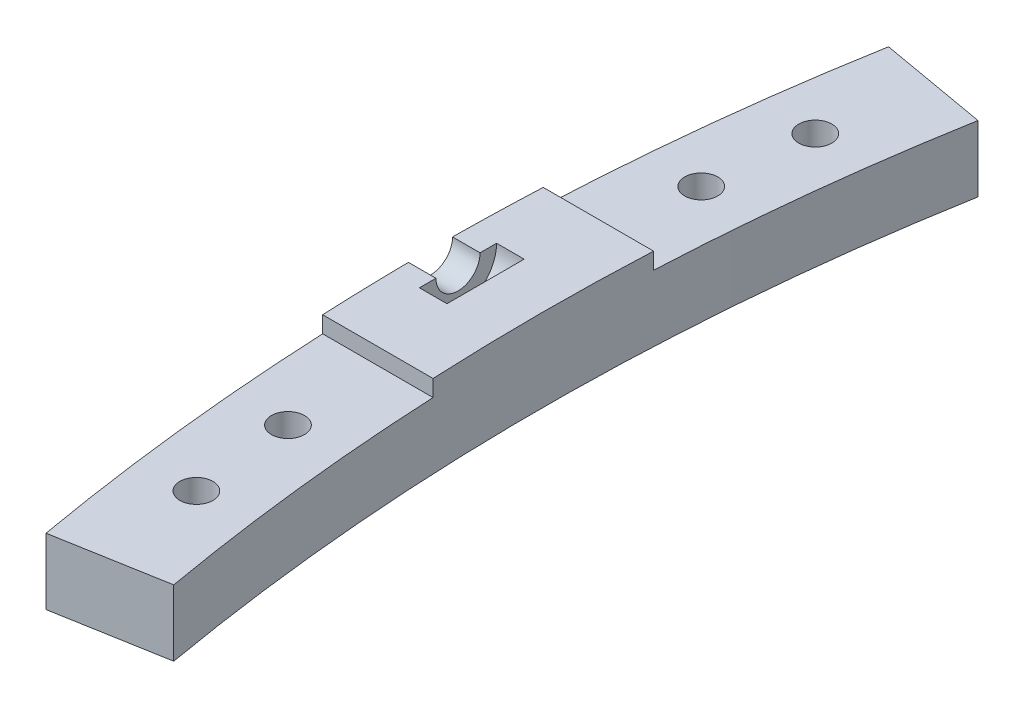
ISO-10303-21;
HEADER;
FILE_DESCRIPTION(('STEP AP214'),'2;1');
FILE_NAME('part.step','',(''),(''),'','','');
FILE_SCHEMA(('AUTOMOTIVE_DESIGN { 1 0 10303 214 1 1 1 1 }'));
ENDSEC;
DATA;
#1=APPLICATION_CONTEXT('core data for automotive mechanical design processes');
#2=APPLICATION_PROTOCOL_DEFINITION('international standard','automotive_design',2000,#1);
#3=PRODUCT_CONTEXT('',#1,'mechanical');
#4=PRODUCT('Part','Part','',(#3));
#5=PRODUCT_RELATED_PRODUCT_CATEGORY('part','',(#4));
#6=PRODUCT_DEFINITION_FORMATION('','',#4);
#7=PRODUCT_DEFINITION_CONTEXT('part definition',#1,'design');
#8=PRODUCT_DEFINITION('design','',#6,#7);
#9=PRODUCT_DEFINITION_SHAPE('','',#8);
#10=(LENGTH_UNIT() NAMED_UNIT(*) SI_UNIT(.MILLI.,.METRE.));
#11=(NAMED_UNIT(*) PLANE_ANGLE_UNIT() SI_UNIT($,.RADIAN.));
#12=(NAMED_UNIT(*) SI_UNIT($,.STERADIAN.) SOLID_ANGLE_UNIT());
#13=UNCERTAINTY_MEASURE_WITH_UNIT(LENGTH_MEASURE(1.E-05),#10,'distance_accuracy_value','');
#14=(GEOMETRIC_REPRESENTATION_CONTEXT(3) GLOBAL_UNCERTAINTY_ASSIGNED_CONTEXT((#13)) GLOBAL_UNIT_ASSIGNED_CONTEXT((#10,
#11,#12)) REPRESENTATION_CONTEXT('',''));
#15=CARTESIAN_POINT('',(0.,0.,0.));
#16=DIRECTION('',(0.,0.,1.));
#17=DIRECTION('',(1.,0.,0.));
#18=AXIS2_PLACEMENT_3D('',#15,#16,#17);
#19=CARTESIAN_POINT('',(0.,7.5,0.));
#20=DIRECTION('',(-0.173648177666931,0.,0.984807753012208));
#21=DIRECTION('',(0.984807753012208,0.,0.173648177666931));
#22=AXIS2_PLACEMENT_3D('',#19,#20,#21);
#23=PLANE('',#22);
#24=DIRECTION('',(0.984807753012208,0.,0.17364817766693));
#25=VECTOR('',#24,1.);
#26=CARTESIAN_POINT('',(-206.809628132564,-1.5,-36.4661173100554));
#27=LINE('',#26,#25);
#28=CARTESIAN_POINT('',(-216.657705662686,-1.5,-38.2025990867248));
#29=VERTEX_POINT('',#28);
#30=CARTESIAN_POINT('',(-206.809628132564,-1.5,-36.4661173100554));
#31=VERTEX_POINT('',#30);
#32=EDGE_CURVE('E177',#29,#31,#27,.T.);
#33=ORIENTED_EDGE('',*,*,#32,.T.);
#34=DIRECTION('',(0.,-1.,0.));
#35=VECTOR('',#34,1.);
#36=CARTESIAN_POINT('',(-206.809628132564,7.5,-36.4661173100555));
#37=LINE('',#36,#35);
#38=CARTESIAN_POINT('',(-206.809628132564,-7.5,-36.4661173100555));
#39=VERTEX_POINT('',#38);
#40=EDGE_CURVE('E180',#31,#39,#37,.T.);
#41=ORIENTED_EDGE('',*,*,#40,.T.);
#42=DIRECTION('',(-0.984807753012208,0.,-0.173648177666931));
#43=VECTOR('',#42,1.);
#44=CARTESIAN_POINT('',(0.,-7.5,0.));
#45=LINE('',#44,#43);
#46=CARTESIAN_POINT('',(-216.657705662686,-7.5,-38.2025990867248));
#47=VERTEX_POINT('',#46);
#48=EDGE_CURVE('E291',#39,#47,#45,.T.);
#49=ORIENTED_EDGE('',*,*,#48,.T.);
#50=DIRECTION('',(0.,-1.,0.));
#51=VECTOR('',#50,1.);
#52=CARTESIAN_POINT('',(-216.657705662686,7.5,-38.2025990867248));
#53=LINE('',#52,#51);
#54=EDGE_CURVE('E182',#29,#47,#53,.T.);
#55=ORIENTED_EDGE('',*,*,#54,.F.);
#56=EDGE_LOOP('',(#33,#41,#49,#55));
#57=FACE_BOUND('',#56,.T.);
#58=ADVANCED_FACE('F35',(#57),#23,.F.);
#59=CARTESIAN_POINT('',(0.,7.5,0.));
#60=DIRECTION('',(0.173648177666931,0.,0.984807753012208));
#61=DIRECTION('',(0.984807753012208,0.,-0.173648177666931));
#62=AXIS2_PLACEMENT_3D('',#59,#60,#61);
#63=PLANE('',#62);
#64=DIRECTION('',(0.,-1.,0.));
#65=VECTOR('',#64,1.);
#66=CARTESIAN_POINT('',(-206.809628132564,7.5,36.4661173100555));
#67=LINE('',#66,#65);
#68=CARTESIAN_POINT('',(-206.809628132564,-1.5,36.4661173100554));
#69=VERTEX_POINT('',#68);
#70=CARTESIAN_POINT('',(-206.809628132564,-7.5,36.4661173100555));
#71=VERTEX_POINT('',#70);
#72=EDGE_CURVE('E299',#69,#71,#67,.T.);
#73=ORIENTED_EDGE('',*,*,#72,.F.);
#74=DIRECTION('',(-0.984807753012208,0.,0.17364817766693));
#75=VECTOR('',#74,1.);
#76=CARTESIAN_POINT('',(-206.809628132564,-1.5,36.4661173100554));
#77=LINE('',#76,#75);
#78=CARTESIAN_POINT('',(-216.657705662686,-1.5,38.2025990867248));
#79=VERTEX_POINT('',#78);
#80=EDGE_CURVE('E274',#69,#79,#77,.T.);
#81=ORIENTED_EDGE('',*,*,#80,.T.);
#82=DIRECTION('',(0.,-1.,0.));
#83=VECTOR('',#82,1.);
#84=CARTESIAN_POINT('',(-216.657705662686,7.5,38.2025990867248));
#85=LINE('',#84,#83);
#86=CARTESIAN_POINT('',(-216.657705662686,-7.5,38.2025990867248));
#87=VERTEX_POINT('',#86);
#88=EDGE_CURVE('E197',#79,#87,#85,.T.);
#89=ORIENTED_EDGE('',*,*,#88,.T.);
#90=DIRECTION('',(-0.984807753012208,0.,0.173648177666931));
#91=VECTOR('',#90,1.);
#92=CARTESIAN_POINT('',(0.,-7.5,0.));
#93=LINE('',#92,#91);
#94=EDGE_CURVE('E296',#71,#87,#93,.T.);
#95=ORIENTED_EDGE('',*,*,#94,.F.);
#96=EDGE_LOOP('',(#73,#81,#89,#95));
#97=FACE_BOUND('',#96,.T.);
#98=ADVANCED_FACE('F166',(#97),#63,.T.);
#99=CARTESIAN_POINT('',(0.,7.5,0.));
#100=DIRECTION('',(0.,-1.,0.));
#101=DIRECTION('',(0.,0.,-1.));
#102=AXIS2_PLACEMENT_3D('',#99,#100,#101);
#103=CYLINDRICAL_SURFACE('',#102,210.);
#104=CARTESIAN_POINT('',(0.,0.,0.));
#105=DIRECTION('',(0.,-1.,0.));
#106=DIRECTION('',(0.,0.,-1.));
#107=AXIS2_PLACEMENT_3D('',#104,#105,#106);
#108=CIRCLE('',#107,210.);
#109=CARTESIAN_POINT('',(-209.76176963403,0.,10.));
#110=VERTEX_POINT('',#109);
#111=CARTESIAN_POINT('',(-209.76176963403,0.,-10.));
#112=VERTEX_POINT('',#111);
#113=EDGE_CURVE('E230',#110,#112,#108,.T.);
#114=ORIENTED_EDGE('',*,*,#113,.F.);
#115=DIRECTION('',(0.,-1.,0.));
#116=VECTOR('',#115,1.);
#117=CARTESIAN_POINT('',(-209.76176963403,32.5390961188828,10.));
#118=LINE('',#117,#116);
#119=CARTESIAN_POINT('',(-209.76176963403,-1.5,10.));
#120=VERTEX_POINT('',#119);
#121=EDGE_CURVE('E279',#110,#120,#118,.T.);
#122=ORIENTED_EDGE('',*,*,#121,.T.);
#123=CARTESIAN_POINT('',(0.,-1.5,0.));
#124=DIRECTION('',(0.,1.,0.));
#125=DIRECTION('',(0.,0.,1.));
#126=AXIS2_PLACEMENT_3D('',#123,#124,#125);
#127=CIRCLE('',#126,210.);
#128=EDGE_CURVE('E271',#120,#69,#127,.T.);
#129=ORIENTED_EDGE('',*,*,#128,.T.);
#130=ORIENTED_EDGE('',*,*,#72,.T.);
#131=CARTESIAN_POINT('',(0.,-7.5,0.));
#132=DIRECTION('',(0.,1.,0.));
#133=DIRECTION('',(0.,0.,1.));
#134=AXIS2_PLACEMENT_3D('',#131,#132,#133);
#135=CIRCLE('',#134,210.);
#136=EDGE_CURVE('E195',#39,#71,#135,.T.);
#137=ORIENTED_EDGE('',*,*,#136,.F.);
#138=ORIENTED_EDGE('',*,*,#40,.F.);
#139=CARTESIAN_POINT('',(0.,-1.5,0.));
#140=DIRECTION('',(0.,1.,0.));
#141=DIRECTION('',(0.,0.,1.));
#142=AXIS2_PLACEMENT_3D('',#139,#140,#141);
#143=CIRCLE('',#142,210.);
#144=CARTESIAN_POINT('',(-209.76176963403,-1.5,-10.));
#145=VERTEX_POINT('',#144);
#146=EDGE_CURVE('E187',#31,#145,#143,.T.);
#147=ORIENTED_EDGE('',*,*,#146,.T.);
#148=DIRECTION('',(0.,-1.,0.));
#149=VECTOR('',#148,1.);
#150=CARTESIAN_POINT('',(-209.76176963403,32.5390961188828,-10.));
#151=LINE('',#150,#149);
#152=EDGE_CURVE('E186',#112,#145,#151,.T.);
#153=ORIENTED_EDGE('',*,*,#152,.F.);
#154=EDGE_LOOP('',(#114,#122,#129,#130,#137,#138,#147,#153));
#155=FACE_BOUND('',#154,.T.);
#156=ADVANCED_FACE('F37',(#155),#103,.F.);
#157=CARTESIAN_POINT('',(0.,7.5,0.));
#158=DIRECTION('',(0.,-1.,0.));
#159=DIRECTION('',(0.,0.,-1.));
#160=AXIS2_PLACEMENT_3D('',#157,#158,#159);
#161=CYLINDRICAL_SURFACE('',#160,220.);
#162=DIRECTION('',(0.,-1.,0.));
#163=VECTOR('',#162,1.);
#164=CARTESIAN_POINT('',(-219.772609758359,32.5390961188828,10.));
#165=LINE('',#164,#163);
#166=CARTESIAN_POINT('',(-219.772609758359,0.,10.));
#167=VERTEX_POINT('',#166);
#168=CARTESIAN_POINT('',(-219.772609758359,-1.5,10.));
#169=VERTEX_POINT('',#168);
#170=EDGE_CURVE('E281',#167,#169,#165,.T.);
#171=ORIENTED_EDGE('',*,*,#170,.F.);
#172=CARTESIAN_POINT('',(0.,0.,0.));
#173=DIRECTION('',(0.,-1.,0.));
#174=DIRECTION('',(0.,0.,-1.));
#175=AXIS2_PLACEMENT_3D('',#172,#173,#174);
#176=CIRCLE('',#175,220.);
#177=CARTESIAN_POINT('',(-219.995436945303,1.28032221009402E-05,2.00000001985987));
#178=VERTEX_POINT('',#177);
#179=EDGE_CURVE('E214',#167,#178,#176,.T.);
#180=ORIENTED_EDGE('',*,*,#179,.T.);
#181=CARTESIAN_POINT('',(-219.990908902837,2.54949305564592E-05,2.00000002591936));
#182=CARTESIAN_POINT('',(-219.9909088471,-0.0329801205389384,2.00000403034315));
#183=CARTESIAN_POINT('',(-219.990916022715,-0.0659874772265435,1.99921678022259));
#184=CARTESIAN_POINT('',(-219.990944841505,-0.131686984836702,1.99604421576729));
#185=CARTESIAN_POINT('',(-219.990966380228,-0.164379695087106,1.99367043876746));
#186=CARTESIAN_POINT('',(-219.991023787441,-0.229450334038055,1.98732542961615));
#187=CARTESIAN_POINT('',(-219.991059585957,-0.261829020419946,1.98336199730463));
#188=CARTESIAN_POINT('',(-219.991145206338,-0.326271218955907,1.97384233279031));
#189=CARTESIAN_POINT('',(-219.991194993972,-0.358335305144357,1.96828998790077));
#190=CARTESIAN_POINT('',(-219.991308199897,-0.422148622653585,1.95559625627867));
#191=CARTESIAN_POINT('',(-219.991371618698,-0.453897842131137,1.94845481000952));
#192=CARTESIAN_POINT('',(-219.991511588414,-0.517082073280422,1.9325869002976));
#193=CARTESIAN_POINT('',(-219.991588171844,-0.548516097980451,1.92385650905892));
#194=CARTESIAN_POINT('',(-219.991753353404,-0.610874375613472,1.90487438730628));
#195=CARTESIAN_POINT('',(-219.991841935093,-0.641799262266957,1.89462473675976));
#196=CARTESIAN_POINT('',(-219.992030794494,-0.70334097560408,1.87256757035672));
#197=CARTESIAN_POINT('',(-219.992131152415,-0.733953938429955,1.86074928953589));
#198=CARTESIAN_POINT('',(-219.992343013102,-0.794936777451035,1.8355317226526));
#199=CARTESIAN_POINT('',(-219.992454631342,-0.825299747117946,1.82211573189001));
#200=CARTESIAN_POINT('',(-219.992686426338,-0.885113104167555,1.79391088113034));
#201=CARTESIAN_POINT('',(-219.992806535192,-0.914568511126935,1.77913267731943));
#202=CARTESIAN_POINT('',(-219.993053690953,-0.972388046336483,1.74830280597472));
#203=CARTESIAN_POINT('',(-219.993180646541,-1.00076063606044,1.73226701257369));
#204=CARTESIAN_POINT('',(-219.99344126088,-1.05660670666691,1.69884687333441));
#205=CARTESIAN_POINT('',(-219.993574902586,-1.08408220555508,1.68146590049603));
#206=CARTESIAN_POINT('',(-219.993847913439,-1.13813580936392,1.64535896901692));
#207=CARTESIAN_POINT('',(-219.993987282743,-1.16471388959116,1.62663297341072));
#208=CARTESIAN_POINT('',(-219.994270705356,-1.21697478482335,1.58783939375478));
#209=CARTESIAN_POINT('',(-219.99441476947,-1.24265520421705,1.56776858329221));
#210=CARTESIAN_POINT('',(-219.994705860713,-1.29301746913009,1.52637541433165));
#211=CARTESIAN_POINT('',(-219.994852889913,-1.31769857775162,1.50505215967964));
#212=CARTESIAN_POINT('',(-219.995149329224,-1.36617788630476,1.46108122017411));
#213=CARTESIAN_POINT('',(-219.995298748868,-1.38996838392072,1.43842505079253));
#214=CARTESIAN_POINT('',(-219.995598493492,-1.43662960021816,1.39183004381227));
#215=CARTESIAN_POINT('',(-219.995748816476,-1.45949172740487,1.36788260155963));
#216=CARTESIAN_POINT('',(-219.996046867252,-1.50385484890476,1.3190731186851));
#217=CARTESIAN_POINT('',(-219.996194605952,-1.52536449173443,1.2942189455876));
#218=CARTESIAN_POINT('',(-219.996485956422,-1.56693861893175,1.24370374618333));
#219=CARTESIAN_POINT('',(-219.996629593364,-1.58701436426977,1.21805199098032));
#220=CARTESIAN_POINT('',(-219.996912431906,-1.62582074894098,1.16584734880919));
#221=CARTESIAN_POINT('',(-219.997051643476,-1.64455455159365,1.13929681396787));
#222=CARTESIAN_POINT('',(-219.997324662941,-1.68068000084828,1.0852972450644));
#223=CARTESIAN_POINT('',(-219.997458470756,-1.69807162746446,1.05784819763153));
#224=CARTESIAN_POINT('',(-219.997719688283,-1.731515975671,1.00205393602615));
#225=CARTESIAN_POINT('',(-219.997847081331,-1.74756527518609,0.973706671049482));
#226=CARTESIAN_POINT('',(-219.998094189706,-1.77829621077494,0.916178251572959));
#227=CARTESIAN_POINT('',(-219.998213882477,-1.79297388137631,0.886994979707456));
#228=CARTESIAN_POINT('',(-219.99844483791,-1.82100270222331,0.827739676021173));
#229=CARTESIAN_POINT('',(-219.998556033128,-1.83434345867634,0.797662733116911));
#230=CARTESIAN_POINT('',(-219.998768740288,-1.8596797914863,0.736675005217262));
#231=CARTESIAN_POINT('',(-219.998870170879,-1.87166419218445,0.705759576503797));
#232=CARTESIAN_POINT('',(-219.999060753003,-1.89402076299834,0.643604257289761));
#233=CARTESIAN_POINT('',(-219.999149988481,-1.90440402543416,0.612368362187968));
#234=CARTESIAN_POINT('',(-219.999315620733,-1.92354152903219,0.549639204908718));
#235=CARTESIAN_POINT('',(-219.999392102714,-1.93230662729597,0.518149257433229));
#236=CARTESIAN_POINT('',(-219.999532069439,-1.94823793954838,0.454849896674932));
#237=CARTESIAN_POINT('',(-219.999595585804,-1.955408047338,0.423041463988725));
#238=CARTESIAN_POINT('',(-219.999709237058,-1.96815310390177,0.359106474455244));
#239=CARTESIAN_POINT('',(-219.99975937189,-1.97372804585566,0.326979916248406));
#240=CARTESIAN_POINT('',(-219.999845878029,-1.98328694072775,0.262409532453783));
#241=CARTESIAN_POINT('',(-219.999882214848,-1.98726690827734,0.229965117104903));
#242=CARTESIAN_POINT('',(-219.999940730871,-1.99363904728712,0.164759791953047));
#243=CARTESIAN_POINT('',(-219.999962839369,-1.99602329116913,0.131998110397101));
#244=CARTESIAN_POINT('',(-219.999992540729,-1.99921089453943,0.066157420490343));
#245=CARTESIAN_POINT('',(-220.000000026233,-2.00000256300872,0.0330778438731048));
#246=CARTESIAN_POINT('',(-220.,-2.,0.));
#247=B_SPLINE_CURVE_WITH_KNOTS('',3,(#181,#182,#183,#184,#185,#186,#187,#188,#189,#190,#191,
#192,#193,#194,#195,#196,#197,#198,#199,#200,#201,#202,#203,#204,#205,#206,#207,#208,#209,#210,
#211,#212,#213,#214,#215,#216,#217,#218,#219,#220,#221,#222,#223,#224,#225,#226,#227,#228,#229,
#230,#231,#232,#233,#234,#235,#236,#237,#238,#239,#240,#241,#242,#243,#244,#245,#246),
.UNSPECIFIED.,.F.,.F.,(4,2,2,2,2,2,2,2,2,2,2,2,2,2,2,2,2,2,2,2,2,2,2,2,2,2,2,2,2,2,2,2,4),(0.,
0.0990098120352928,0.197307340229156,0.295128347103944,0.39271204907366,0.490299407688165,
0.588131357477474,0.685830585183113,0.784238769304348,0.883785123878142,0.982609913063426,
1.08034281784735,1.17783814070924,1.27533614407649,1.37307707060712,1.47088880585223,
1.5694099857165,1.66869732534898,1.76726656744023,1.8649489821143,1.96239299030713,
2.05983844921885,2.15752520536166,2.25548616720321,2.35415766578728,2.45359063993971,
2.55230040347897,2.65032167769756,2.74810096338728,2.84588066713364,2.94390319241927,
3.04240915013852,3.1416356344712),.UNSPECIFIED.);
#248=CARTESIAN_POINT('',(-220.,-2.,0.));
#249=VERTEX_POINT('',#248);
#250=EDGE_CURVE('E60',#178,#249,#247,.T.);
#251=ORIENTED_EDGE('',*,*,#250,.T.);
#252=CARTESIAN_POINT('',(-220.,-2.,0.));
#253=CARTESIAN_POINT('',(-220.000000010613,-2.00000102153851,-0.0264510910848524));
#254=CARTESIAN_POINT('',(-219.999995229921,-1.99949529344123,-0.0529029432307503));
#255=CARTESIAN_POINT('',(-219.999976219647,-1.99746070070361,-0.105603904716159));
#256=CARTESIAN_POINT('',(-219.999962048466,-1.99593815939092,-0.131853259026521));
#257=CARTESIAN_POINT('',(-219.999924476883,-1.99187019733549,-0.184149418022017));
#258=CARTESIAN_POINT('',(-219.999901119933,-1.98932959135356,-0.210196595950305));
#259=CARTESIAN_POINT('',(-219.999845410793,-1.983227371353,-0.262088174027472));
#260=CARTESIAN_POINT('',(-219.9998130871,-1.97966899088132,-0.287932954179401));
#261=CARTESIAN_POINT('',(-219.999739672388,-1.97153274235715,-0.339419779170902));
#262=CARTESIAN_POINT('',(-219.99969859529,-1.96695649256651,-0.365062079647499));
#263=CARTESIAN_POINT('',(-219.999607900678,-1.95678616021779,-0.416144081738603));
#264=CARTESIAN_POINT('',(-219.999558283142,-1.95119207505807,-0.441583782835083));
#265=CARTESIAN_POINT('',(-219.999450731847,-1.9389876919062,-0.49226086648363));
#266=CARTESIAN_POINT('',(-219.999392785021,-1.93237579604974,-0.51749786410461));
#267=CARTESIAN_POINT('',(-219.999268796804,-1.91813738627874,-0.567769941237892));
#268=CARTESIAN_POINT('',(-219.999202730434,-1.91050773474378,-0.592804131629155));
#269=CARTESIAN_POINT('',(-219.99906280341,-1.89424482382492,-0.642642029652548));
#270=CARTESIAN_POINT('',(-219.998988916054,-1.88560811532778,-0.667444611110266));
#271=CARTESIAN_POINT('',(-219.998833499111,-1.86732541555779,-0.716849409851232));
#272=CARTESIAN_POINT('',(-219.998751925012,-1.8576735026943,-0.74144943369842));
#273=CARTESIAN_POINT('',(-219.998581873924,-1.83742462494737,-0.790297878479858));
#274=CARTESIAN_POINT('',(-219.998493387404,-1.82682635212366,-0.814545757219763));
#275=CARTESIAN_POINT('',(-219.998310741967,-1.80476070606011,-0.862462281405873));
#276=CARTESIAN_POINT('',(-219.998216621323,-1.79329908471358,-0.886133573727658));
#277=CARTESIAN_POINT('',(-219.998023391418,-1.76952197102024,-0.932870183444575));
#278=CARTESIAN_POINT('',(-219.997924314382,-1.75721183679726,-0.955938225931451));
#279=CARTESIAN_POINT('',(-219.997721626057,-1.73172743227803,-1.00149720358726));
#280=CARTESIAN_POINT('',(-219.99761802995,-1.71855599044985,-1.02398972054132));
#281=CARTESIAN_POINT('',(-219.997406842504,-1.69135044656174,-1.06839826686543));
#282=CARTESIAN_POINT('',(-219.997299257703,-1.67731773345395,-1.09031514705931));
#283=CARTESIAN_POINT('',(-219.997080616295,-1.64839109184519,-1.13357318095671));
#284=CARTESIAN_POINT('',(-219.996969559667,-1.63349715823886,-1.15491433124615));
#285=CARTESIAN_POINT('',(-219.996744482375,-1.60284946571431,-1.19702178418617));
#286=CARTESIAN_POINT('',(-219.996630457289,-1.58709438006606,-1.21778712104268));
#287=CARTESIAN_POINT('',(-219.9963999352,-1.55472569418271,-1.25874392842057));
#288=CARTESIAN_POINT('',(-219.996283431534,-1.53810954228534,-1.27893338181079));
#289=CARTESIAN_POINT('',(-219.996048702796,-1.50405970567614,-1.31869303386023));
#290=CARTESIAN_POINT('',(-219.995930474314,-1.48662418691128,-1.33826166131736));
#291=CARTESIAN_POINT('',(-219.995692489295,-1.45090093559711,-1.37682984058311));
#292=CARTESIAN_POINT('',(-219.995572727831,-1.43260860321978,-1.39582512933979));
#293=CARTESIAN_POINT('',(-219.995332527559,-1.39523641802329,-1.43318398125217));
#294=CARTESIAN_POINT('',(-219.995212088014,-1.3761535903506,-1.45154456862583));
#295=CARTESIAN_POINT('',(-219.994972601692,-1.33740569719608,-1.48739686157417));
#296=CARTESIAN_POINT('',(-219.994853550905,-1.31774494066036,-1.5048932213825));
#297=CARTESIAN_POINT('',(-219.994617737796,-1.27788850186418,-1.53897850768248));
#298=CARTESIAN_POINT('',(-219.994500965307,-1.25769750276894,-1.5555729086638));
#299=CARTESIAN_POINT('',(-219.994270012038,-1.21673838627533,-1.58789871473526));
#300=CARTESIAN_POINT('',(-219.994155824292,-1.19597227219574,-1.60363265748927));
#301=CARTESIAN_POINT('',(-219.99393059303,-1.15386405126903,-1.63423868389607));
#302=CARTESIAN_POINT('',(-219.993819544861,-1.13252289935474,-1.64911208117265));
#303=CARTESIAN_POINT('',(-219.993601112465,-1.08926564434496,-1.67799827367517));
#304=CARTESIAN_POINT('',(-219.993493728265,-1.06734953679626,-1.69201106223261));
#305=CARTESIAN_POINT('',(-219.993283110999,-1.02294331770884,-1.71917738105956));
#306=CARTESIAN_POINT('',(-219.993179884791,-1.00045235040514,-1.73232951236196));
#307=CARTESIAN_POINT('',(-219.992978038431,-0.954897244353465,-1.75777592489098));
#308=CARTESIAN_POINT('',(-219.992879433833,-0.931831521627883,-1.77006736978049));
#309=CARTESIAN_POINT('',(-219.992687589958,-0.88520936915666,-1.79375231606713));
#310=CARTESIAN_POINT('',(-219.992594357171,-0.861652390743041,-1.80514473705623));
#311=CARTESIAN_POINT('',(-219.99241327333,-0.813970570851901,-1.827080530338));
#312=CARTESIAN_POINT('',(-219.992325459003,-0.78984312358062,-1.83761823434736));
#313=CARTESIAN_POINT('',(-219.992155620893,-0.741036093040836,-1.85783963411272));
#314=CARTESIAN_POINT('',(-219.99207364165,-0.716353836199296,-1.86751687791952));
#315=CARTESIAN_POINT('',(-219.9919173009,-0.666783155899008,-1.8858435190261));
#316=CARTESIAN_POINT('',(-219.991842895557,-0.641896940678156,-1.89449888362209));
#317=CARTESIAN_POINT('',(-219.991702301205,-0.592005604122073,-1.9107548652183));
#318=CARTESIAN_POINT('',(-219.991636050397,-0.567003088228136,-1.91836347445011));
#319=CARTESIAN_POINT('',(-219.991511772499,-0.516794847964531,-1.93256262928066));
#320=CARTESIAN_POINT('',(-219.991453720358,-0.491590002794809,-1.93915628204774));
#321=CARTESIAN_POINT('',(-219.991346102325,-0.440977714487515,-1.95132700323594));
#322=CARTESIAN_POINT('',(-219.991296523293,-0.415570650219197,-1.95690564671376));
#323=CARTESIAN_POINT('',(-219.991206070271,-0.364554395965334,-1.96704790856202));
#324=CARTESIAN_POINT('',(-219.991165196383,-0.338945203615498,-1.97161151504131));
#325=CARTESIAN_POINT('',(-219.991092329225,-0.28752509283051,-1.97972530551409));
#326=CARTESIAN_POINT('',(-219.991060350189,-0.261713918265869,-1.98327386553779));
#327=CARTESIAN_POINT('',(-219.991005405541,-0.209889935114316,-1.98935918072665));
#328=CARTESIAN_POINT('',(-219.990982468711,-0.183876747185679,-1.99189270534566));
#329=CARTESIAN_POINT('',(-219.990945784784,-0.131771268115654,-1.9959400816095));
#330=CARTESIAN_POINT('',(-219.990932037853,-0.1056789755461,-1.99745391473324));
#331=CARTESIAN_POINT('',(-219.990913611749,-0.0532933527566719,-1.99948225811357));
#332=CARTESIAN_POINT('',(-219.990908988963,-0.0269997743486207,-1.99999055411715));
#333=CARTESIAN_POINT('',(-219.99090890342,-0.000462488466970797,-1.99999996171917));
#334=CARTESIAN_POINT('',(-219.990908903025,-0.000216123632512022,-2.0000000052415));
#335=CARTESIAN_POINT('',(-219.990908903028,3.02409496680256E-05,-2.00000000495674));
#336=B_SPLINE_CURVE_WITH_KNOTS('',3,(#252,#253,#254,#255,#256,#257,#258,#259,#260,#261,#262,
#263,#264,#265,#266,#267,#268,#269,#270,#271,#272,#273,#274,#275,#276,#277,#278,#279,#280,#281,
#282,#283,#284,#285,#286,#287,#288,#289,#290,#291,#292,#293,#294,#295,#296,#297,#298,#299,#300,
#301,#302,#303,#304,#305,#306,#307,#308,#309,#310,#311,#312,#313,#314,#315,#316,#317,#318,#319,
#320,#321,#322,#323,#324,#325,#326,#327,#328,#329,#330,#331,#332,#333,#334,#335),.UNSPECIFIED.,
.F.,.F.,(4,2,2,2,2,2,2,2,2,2,2,2,2,2,2,2,2,2,2,2,2,2,2,2,2,2,2,2,2,2,2,2,2,2,2,2,2,2,2,2,2,4),
(0.,0.0793495147885793,0.158210111966056,0.236702072092927,0.314947375782138,0.393069159055002,
0.471191142013618,0.549437043814023,0.627929997657672,0.706700151456191,0.78595833382122,
0.865327804451572,0.94420867063091,1.02263042124772,1.10080645175037,1.17885956348896,
1.25691313797898,1.33509055454489,1.41351460801572,1.49212344739736,1.5712179722648,
1.65064343996158,1.72957981666222,1.80796604626892,1.88610702399484,1.9641253889016,
2.04214435826368,2.12028714649598,2.19867638415019,2.27715843568458,2.35612440074857,
2.43563977863051,2.51466508181623,2.59304884066749,2.67118764847014,2.74920414930318,
2.8272215640507,2.90536310927363,2.9837514161826,3.06214114685357,3.14101383379686,
3.14175292829286),.UNSPECIFIED.);
#337=CARTESIAN_POINT('',(-219.995436071064,1.51815081395836E-05,-2.00000000356213));
#338=VERTEX_POINT('',#337);
#339=EDGE_CURVE('E138',#249,#338,#336,.T.);
#340=ORIENTED_EDGE('',*,*,#339,.T.);
#341=CARTESIAN_POINT('',(-219.772609758359,0.,-10.));
#342=VERTEX_POINT('',#341);
#343=EDGE_CURVE('E128',#338,#342,#176,.T.);
#344=ORIENTED_EDGE('',*,*,#343,.T.);
#345=DIRECTION('',(0.,-1.,0.));
#346=VECTOR('',#345,1.);
#347=CARTESIAN_POINT('',(-219.772609758359,32.5390961188828,-10.));
#348=LINE('',#347,#346);
#349=CARTESIAN_POINT('',(-219.772609758359,-1.5,-10.));
#350=VERTEX_POINT('',#349);
#351=EDGE_CURVE('E270',#342,#350,#348,.T.);
#352=ORIENTED_EDGE('',*,*,#351,.T.);
#353=CARTESIAN_POINT('',(0.,-1.5,0.));
#354=DIRECTION('',(0.,1.,0.));
#355=DIRECTION('',(0.,0.,1.));
#356=AXIS2_PLACEMENT_3D('',#353,#354,#355);
#357=CIRCLE('',#356,220.);
#358=EDGE_CURVE('E213',#350,#29,#357,.F.);
#359=ORIENTED_EDGE('',*,*,#358,.T.);
#360=ORIENTED_EDGE('',*,*,#54,.T.);
#361=CARTESIAN_POINT('',(0.,-7.5,0.));
#362=DIRECTION('',(0.,1.,0.));
#363=DIRECTION('',(0.,0.,1.));
#364=AXIS2_PLACEMENT_3D('',#361,#362,#363);
#365=CIRCLE('',#364,220.);
#366=EDGE_CURVE('E293',#47,#87,#365,.T.);
#367=ORIENTED_EDGE('',*,*,#366,.T.);
#368=ORIENTED_EDGE('',*,*,#88,.F.);
#369=CARTESIAN_POINT('',(0.,-1.5,0.));
#370=DIRECTION('',(0.,1.,0.));
#371=DIRECTION('',(0.,0.,1.));
#372=AXIS2_PLACEMENT_3D('',#369,#370,#371);
#373=CIRCLE('',#372,220.);
#374=EDGE_CURVE('E267',#169,#79,#373,.T.);
#375=ORIENTED_EDGE('',*,*,#374,.F.);
#376=EDGE_LOOP('',(#171,#180,#251,#340,#344,#352,#359,#360,#367,#368,#375));
#377=FACE_BOUND('',#376,.T.);
#378=ADVANCED_FACE('F147',(#377),#161,.T.);
#379=CARTESIAN_POINT('',(0.,-7.5,0.));
#380=DIRECTION('',(0.,1.,0.));
#381=DIRECTION('',(0.,0.,1.));
#382=AXIS2_PLACEMENT_3D('',#379,#380,#381);
#383=PLANE('',#382);
#384=CARTESIAN_POINT('',(-213.160645195369,-7.5,-28.0631313273113));
#385=DIRECTION('',(0.,1.,0.));
#386=DIRECTION('',(0.,0.,1.));
#387=AXIS2_PLACEMENT_3D('',#384,#385,#386);
#388=CIRCLE('',#387,1.5);
#389=CARTESIAN_POINT('',(-213.160645195369,-7.5,-26.5631313273113));
#390=VERTEX_POINT('',#389);
#391=EDGE_CURVE('E205',#390,#390,#388,.T.);
#392=ORIENTED_EDGE('',*,*,#391,.T.);
#393=EDGE_LOOP('',(#392));
#394=FACE_BOUND('',#393,.T.);
#395=CARTESIAN_POINT('',(-214.181860089725,-7.5,-18.7384846907465));
#396=DIRECTION('',(0.,1.,0.));
#397=DIRECTION('',(0.,0.,1.));
#398=AXIS2_PLACEMENT_3D('',#395,#396,#397);
#399=CIRCLE('',#398,1.5);
#400=CARTESIAN_POINT('',(-214.181860089725,-7.5,-17.2384846907465));
#401=VERTEX_POINT('',#400);
#402=EDGE_CURVE('E262',#401,#401,#399,.T.);
#403=ORIENTED_EDGE('',*,*,#402,.T.);
#404=EDGE_LOOP('',(#403));
#405=FACE_BOUND('',#404,.T.);
#406=CARTESIAN_POINT('',(-214.181860089725,-7.5,18.7384846907466));
#407=DIRECTION('',(0.,1.,0.));
#408=DIRECTION('',(0.,0.,-1.));
#409=AXIS2_PLACEMENT_3D('',#406,#407,#408);
#410=CIRCLE('',#409,1.5);
#411=CARTESIAN_POINT('',(-214.181860089725,-7.5,17.2384846907466));
#412=VERTEX_POINT('',#411);
#413=EDGE_CURVE('E255',#412,#412,#410,.T.);
#414=ORIENTED_EDGE('',*,*,#413,.T.);
#415=EDGE_LOOP('',(#414));
#416=FACE_BOUND('',#415,.T.);
#417=CARTESIAN_POINT('',(-213.160645195369,-7.5,28.0631313273113));
#418=DIRECTION('',(0.,1.,0.));
#419=DIRECTION('',(0.,0.,-1.));
#420=AXIS2_PLACEMENT_3D('',#417,#418,#419);
#421=CIRCLE('',#420,1.5);
#422=CARTESIAN_POINT('',(-213.160645195369,-7.5,26.5631313273113));
#423=VERTEX_POINT('',#422);
#424=EDGE_CURVE('E252',#423,#423,#421,.T.);
#425=ORIENTED_EDGE('',*,*,#424,.T.);
#426=EDGE_LOOP('',(#425));
#427=FACE_BOUND('',#426,.T.);
#428=ORIENTED_EDGE('',*,*,#136,.T.);
#429=ORIENTED_EDGE('',*,*,#94,.T.);
#430=ORIENTED_EDGE('',*,*,#366,.F.);
#431=ORIENTED_EDGE('',*,*,#48,.F.);
#432=EDGE_LOOP('',(#428,#429,#430,#431));
#433=FACE_BOUND('',#432,.T.);
#434=ADVANCED_FACE('F165',(#394,#405,#416,#427,#433),#383,.F.);
#435=CARTESIAN_POINT('',(-209.76176963403,32.5390961188828,10.));
#436=DIRECTION('',(0.,0.,1.));
#437=DIRECTION('',(1.,0.,0.));
#438=AXIS2_PLACEMENT_3D('',#435,#436,#437);
#439=PLANE('',#438);
#440=DIRECTION('',(1.,0.,0.));
#441=VECTOR('',#440,1.);
#442=CARTESIAN_POINT('',(-209.76176963403,0.,10.));
#443=LINE('',#442,#441);
#444=EDGE_CURVE('E215',#167,#110,#443,.T.);
#445=ORIENTED_EDGE('',*,*,#444,.F.);
#446=ORIENTED_EDGE('',*,*,#170,.T.);
#447=DIRECTION('',(-1.,0.,0.));
#448=VECTOR('',#447,1.);
#449=CARTESIAN_POINT('',(220.,-1.5,10.));
#450=LINE('',#449,#448);
#451=EDGE_CURVE('E269',#120,#169,#450,.T.);
#452=ORIENTED_EDGE('',*,*,#451,.F.);
#453=ORIENTED_EDGE('',*,*,#121,.F.);
#454=EDGE_LOOP('',(#445,#446,#452,#453));
#455=FACE_BOUND('',#454,.T.);
#456=ADVANCED_FACE('F307',(#455),#439,.T.);
#457=CARTESIAN_POINT('',(0.,-1.5,0.));
#458=DIRECTION('',(0.,1.,0.));
#459=DIRECTION('',(0.,0.,1.));
#460=AXIS2_PLACEMENT_3D('',#457,#458,#459);
#461=PLANE('',#460);
#462=CARTESIAN_POINT('',(-214.181860089725,-1.5,18.7384846907466));
#463=DIRECTION('',(0.,1.,0.));
#464=DIRECTION('',(0.,0.,1.));
#465=AXIS2_PLACEMENT_3D('',#462,#463,#464);
#466=CIRCLE('',#465,1.5);
#467=CARTESIAN_POINT('',(-214.181860089725,-1.5,20.2384846907466));
#468=VERTEX_POINT('',#467);
#469=EDGE_CURVE('E211',#468,#468,#466,.T.);
#470=ORIENTED_EDGE('',*,*,#469,.F.);
#471=EDGE_LOOP('',(#470));
#472=FACE_BOUND('',#471,.T.);
#473=CARTESIAN_POINT('',(-213.160645195369,-1.5,28.0631313273113));
#474=DIRECTION('',(0.,1.,0.));
#475=DIRECTION('',(0.,0.,1.));
#476=AXIS2_PLACEMENT_3D('',#473,#474,#475);
#477=CIRCLE('',#476,1.5);
#478=CARTESIAN_POINT('',(-213.160645195369,-1.5,29.5631313273113));
#479=VERTEX_POINT('',#478);
#480=EDGE_CURVE('E208',#479,#479,#477,.T.);
#481=ORIENTED_EDGE('',*,*,#480,.F.);
#482=EDGE_LOOP('',(#481));
#483=FACE_BOUND('',#482,.T.);
#484=ORIENTED_EDGE('',*,*,#128,.F.);
#485=ORIENTED_EDGE('',*,*,#451,.T.);
#486=ORIENTED_EDGE('',*,*,#374,.T.);
#487=ORIENTED_EDGE('',*,*,#80,.F.);
#488=EDGE_LOOP('',(#484,#485,#486,#487));
#489=FACE_BOUND('',#488,.T.);
#490=ADVANCED_FACE('F312',(#472,#483,#489),#461,.T.);
#491=CARTESIAN_POINT('',(-209.76176963403,32.5390961188828,-10.));
#492=DIRECTION('',(0.,0.,-1.));
#493=DIRECTION('',(-1.,0.,0.));
#494=AXIS2_PLACEMENT_3D('',#491,#492,#493);
#495=PLANE('',#494);
#496=DIRECTION('',(-1.,0.,0.));
#497=VECTOR('',#496,1.);
#498=CARTESIAN_POINT('',(-209.76176963403,0.,-10.));
#499=LINE('',#498,#497);
#500=EDGE_CURVE('E131',#112,#342,#499,.T.);
#501=ORIENTED_EDGE('',*,*,#500,.F.);
#502=ORIENTED_EDGE('',*,*,#152,.T.);
#503=DIRECTION('',(-1.,0.,0.));
#504=VECTOR('',#503,1.);
#505=CARTESIAN_POINT('',(-209.76176963403,-1.5,-10.));
#506=LINE('',#505,#504);
#507=EDGE_CURVE('E284',#145,#350,#506,.T.);
#508=ORIENTED_EDGE('',*,*,#507,.T.);
#509=ORIENTED_EDGE('',*,*,#351,.F.);
#510=EDGE_LOOP('',(#501,#502,#508,#509));
#511=FACE_BOUND('',#510,.T.);
#512=ADVANCED_FACE('F317',(#511),#495,.T.);
#513=CARTESIAN_POINT('',(0.,-1.5,0.));
#514=DIRECTION('',(0.,1.,0.));
#515=DIRECTION('',(0.,0.,1.));
#516=AXIS2_PLACEMENT_3D('',#513,#514,#515);
#517=PLANE('',#516);
#518=CARTESIAN_POINT('',(-213.160645195369,-1.5,-28.0631313273113));
#519=DIRECTION('',(0.,1.,0.));
#520=DIRECTION('',(0.,0.,1.));
#521=AXIS2_PLACEMENT_3D('',#518,#519,#520);
#522=CIRCLE('',#521,1.5);
#523=CARTESIAN_POINT('',(-213.160645195369,-1.5,-26.5631313273113));
#524=VERTEX_POINT('',#523);
#525=EDGE_CURVE('E204',#524,#524,#522,.T.);
#526=ORIENTED_EDGE('',*,*,#525,.F.);
#527=EDGE_LOOP('',(#526));
#528=FACE_BOUND('',#527,.T.);
#529=CARTESIAN_POINT('',(-214.181860089725,-1.5,-18.7384846907465));
#530=DIRECTION('',(0.,1.,0.));
#531=DIRECTION('',(0.,0.,1.));
#532=AXIS2_PLACEMENT_3D('',#529,#530,#531);
#533=CIRCLE('',#532,1.5);
#534=CARTESIAN_POINT('',(-214.181860089725,-1.5,-17.2384846907465));
#535=VERTEX_POINT('',#534);
#536=EDGE_CURVE('E201',#535,#535,#533,.T.);
#537=ORIENTED_EDGE('',*,*,#536,.F.);
#538=EDGE_LOOP('',(#537));
#539=FACE_BOUND('',#538,.T.);
#540=ORIENTED_EDGE('',*,*,#146,.F.);
#541=ORIENTED_EDGE('',*,*,#32,.F.);
#542=ORIENTED_EDGE('',*,*,#358,.F.);
#543=ORIENTED_EDGE('',*,*,#507,.F.);
#544=EDGE_LOOP('',(#540,#541,#542,#543));
#545=FACE_BOUND('',#544,.T.);
#546=ADVANCED_FACE('F320',(#528,#539,#545),#517,.T.);
#547=CARTESIAN_POINT('',(-214.181860089725,-7.5,-18.7384846907465));
#548=DIRECTION('',(0.,1.,0.));
#549=DIRECTION('',(0.,0.,1.));
#550=AXIS2_PLACEMENT_3D('',#547,#548,#549);
#551=CYLINDRICAL_SURFACE('',#550,1.5);
#552=ORIENTED_EDGE('',*,*,#536,.T.);
#553=EDGE_LOOP('',(#552));
#554=FACE_BOUND('',#553,.T.);
#555=ORIENTED_EDGE('',*,*,#402,.F.);
#556=EDGE_LOOP('',(#555));
#557=FACE_BOUND('',#556,.T.);
#558=ADVANCED_FACE('F323',(#554,#557),#551,.F.);
#559=CARTESIAN_POINT('',(-213.160645195369,-7.5,-28.0631313273113));
#560=DIRECTION('',(0.,1.,0.));
#561=DIRECTION('',(0.,0.,1.));
#562=AXIS2_PLACEMENT_3D('',#559,#560,#561);
#563=CYLINDRICAL_SURFACE('',#562,1.5);
#564=ORIENTED_EDGE('',*,*,#525,.T.);
#565=EDGE_LOOP('',(#564));
#566=FACE_BOUND('',#565,.T.);
#567=ORIENTED_EDGE('',*,*,#391,.F.);
#568=EDGE_LOOP('',(#567));
#569=FACE_BOUND('',#568,.T.);
#570=ADVANCED_FACE('F333',(#566,#569),#563,.F.);
#571=CARTESIAN_POINT('',(-213.160645195369,-7.5,28.0631313273113));
#572=DIRECTION('',(0.,1.,0.));
#573=DIRECTION('',(0.,0.,1.));
#574=AXIS2_PLACEMENT_3D('',#571,#572,#573);
#575=CYLINDRICAL_SURFACE('',#574,1.5);
#576=ORIENTED_EDGE('',*,*,#480,.T.);
#577=EDGE_LOOP('',(#576));
#578=FACE_BOUND('',#577,.T.);
#579=ORIENTED_EDGE('',*,*,#424,.F.);
#580=EDGE_LOOP('',(#579));
#581=FACE_BOUND('',#580,.T.);
#582=ADVANCED_FACE('F329',(#578,#581),#575,.F.);
#583=CARTESIAN_POINT('',(-214.181860089725,-7.5,18.7384846907466));
#584=DIRECTION('',(0.,1.,0.));
#585=DIRECTION('',(0.,0.,1.));
#586=AXIS2_PLACEMENT_3D('',#583,#584,#585);
#587=CYLINDRICAL_SURFACE('',#586,1.5);
#588=ORIENTED_EDGE('',*,*,#469,.T.);
#589=EDGE_LOOP('',(#588));
#590=FACE_BOUND('',#589,.T.);
#591=ORIENTED_EDGE('',*,*,#413,.F.);
#592=EDGE_LOOP('',(#591));
#593=FACE_BOUND('',#592,.T.);
#594=ADVANCED_FACE('F332',(#590,#593),#587,.F.);
#595=CARTESIAN_POINT('',(-220.,0.,0.));
#596=DIRECTION('',(1.,0.,0.));
#597=DIRECTION('',(0.,0.,-1.));
#598=AXIS2_PLACEMENT_3D('',#595,#596,#597);
#599=CYLINDRICAL_SURFACE('',#598,2.);
#600=CARTESIAN_POINT('',(-217.5,0.,0.));
#601=DIRECTION('',(1.,0.,0.));
#602=DIRECTION('',(0.,0.,-1.));
#603=AXIS2_PLACEMENT_3D('',#600,#601,#602);
#604=CIRCLE('',#603,2.);
#605=CARTESIAN_POINT('',(-217.5,0.,2.));
#606=VERTEX_POINT('',#605);
#607=CARTESIAN_POINT('',(-217.5,0.,-2.));
#608=VERTEX_POINT('',#607);
#609=EDGE_CURVE('E142',#606,#608,#604,.T.);
#610=ORIENTED_EDGE('',*,*,#609,.T.);
#611=DIRECTION('',(1.,0.,0.));
#612=VECTOR('',#611,1.);
#613=CARTESIAN_POINT('',(-220.,0.,-2.));
#614=LINE('',#613,#612);
#615=EDGE_CURVE('E53',#608,#338,#614,.F.);
#616=ORIENTED_EDGE('',*,*,#615,.T.);
#617=ORIENTED_EDGE('',*,*,#339,.F.);
#618=ORIENTED_EDGE('',*,*,#250,.F.);
#619=DIRECTION('',(1.,0.,0.));
#620=VECTOR('',#619,1.);
#621=CARTESIAN_POINT('',(-220.,0.,2.));
#622=LINE('',#621,#620);
#623=EDGE_CURVE('E217',#178,#606,#622,.T.);
#624=ORIENTED_EDGE('',*,*,#623,.T.);
#625=EDGE_LOOP('',(#610,#616,#617,#618,#624));
#626=FACE_BOUND('',#625,.T.);
#627=ADVANCED_FACE('F137',(#626),#599,.F.);
#628=CARTESIAN_POINT('',(-215.,0.,0.));
#629=DIRECTION('',(-1.,0.,0.));
#630=DIRECTION('',(0.,0.,1.));
#631=AXIS2_PLACEMENT_3D('',#628,#629,#630);
#632=PLANE('',#631);
#633=DIRECTION('',(0.,0.,1.));
#634=VECTOR('',#633,1.);
#635=CARTESIAN_POINT('',(-215.,0.,0.));
#636=LINE('',#635,#634);
#637=CARTESIAN_POINT('',(-215.,0.,-3.50000000000001));
#638=VERTEX_POINT('',#637);
#639=CARTESIAN_POINT('',(-215.,0.,3.50000000000001));
#640=VERTEX_POINT('',#639);
#641=EDGE_CURVE('E143',#638,#640,#636,.T.);
#642=ORIENTED_EDGE('',*,*,#641,.F.);
#643=CARTESIAN_POINT('',(-215.,0.,0.));
#644=DIRECTION('',(-1.,0.,0.));
#645=DIRECTION('',(0.,0.,1.));
#646=AXIS2_PLACEMENT_3D('',#643,#644,#645);
#647=CIRCLE('',#646,3.50000000000001);
#648=EDGE_CURVE('E246',#638,#640,#647,.T.);
#649=ORIENTED_EDGE('',*,*,#648,.T.);
#650=EDGE_LOOP('',(#642,#649));
#651=FACE_BOUND('',#650,.T.);
#652=ADVANCED_FACE('F251',(#651),#632,.T.);
#653=CARTESIAN_POINT('',(-215.,0.,0.));
#654=DIRECTION('',(-1.,0.,0.));
#655=DIRECTION('',(0.,0.,1.));
#656=AXIS2_PLACEMENT_3D('',#653,#654,#655);
#657=CYLINDRICAL_SURFACE('',#656,3.50000000000001);
#658=DIRECTION('',(-1.,0.,0.));
#659=VECTOR('',#658,1.);
#660=CARTESIAN_POINT('',(-215.,0.,3.50000000000001));
#661=LINE('',#660,#659);
#662=CARTESIAN_POINT('',(-217.5,0.,3.50000000000001));
#663=VERTEX_POINT('',#662);
#664=EDGE_CURVE('E133',#640,#663,#661,.T.);
#665=ORIENTED_EDGE('',*,*,#664,.F.);
#666=ORIENTED_EDGE('',*,*,#648,.F.);
#667=DIRECTION('',(-1.,0.,0.));
#668=VECTOR('',#667,1.);
#669=CARTESIAN_POINT('',(-215.,0.,-3.50000000000001));
#670=LINE('',#669,#668);
#671=CARTESIAN_POINT('',(-217.5,0.,-3.50000000000001));
#672=VERTEX_POINT('',#671);
#673=EDGE_CURVE('E239',#672,#638,#670,.F.);
#674=ORIENTED_EDGE('',*,*,#673,.F.);
#675=CARTESIAN_POINT('',(-217.5,0.,0.));
#676=DIRECTION('',(-1.,0.,0.));
#677=DIRECTION('',(0.,0.,1.));
#678=AXIS2_PLACEMENT_3D('',#675,#676,#677);
#679=CIRCLE('',#678,3.50000000000001);
#680=EDGE_CURVE('E148',#672,#663,#679,.T.);
#681=ORIENTED_EDGE('',*,*,#680,.T.);
#682=EDGE_LOOP('',(#665,#666,#674,#681));
#683=FACE_BOUND('',#682,.T.);
#684=ADVANCED_FACE('F244',(#683),#657,.F.);
#685=CARTESIAN_POINT('',(-217.5,0.,0.));
#686=DIRECTION('',(1.,0.,0.));
#687=DIRECTION('',(0.,0.,-1.));
#688=AXIS2_PLACEMENT_3D('',#685,#686,#687);
#689=PLANE('',#688);
#690=DIRECTION('',(0.,0.,-1.));
#691=VECTOR('',#690,1.);
#692=CARTESIAN_POINT('',(-217.5,0.,0.));
#693=LINE('',#692,#691);
#694=EDGE_CURVE('E11',#663,#606,#693,.T.);
#695=ORIENTED_EDGE('',*,*,#694,.F.);
#696=ORIENTED_EDGE('',*,*,#680,.F.);
#697=EDGE_CURVE('E45',#608,#672,#693,.T.);
#698=ORIENTED_EDGE('',*,*,#697,.F.);
#699=ORIENTED_EDGE('',*,*,#609,.F.);
#700=EDGE_LOOP('',(#695,#696,#698,#699));
#701=FACE_BOUND('',#700,.T.);
#702=ADVANCED_FACE('F235',(#701),#689,.T.);
#703=CARTESIAN_POINT('',(0.,0.,0.));
#704=DIRECTION('',(0.,-1.,0.));
#705=DIRECTION('',(0.,0.,-1.));
#706=AXIS2_PLACEMENT_3D('',#703,#704,#705);
#707=PLANE('',#706);
#708=ORIENTED_EDGE('',*,*,#444,.T.);
#709=ORIENTED_EDGE('',*,*,#113,.T.);
#710=ORIENTED_EDGE('',*,*,#500,.T.);
#711=ORIENTED_EDGE('',*,*,#343,.F.);
#712=ORIENTED_EDGE('',*,*,#615,.F.);
#713=ORIENTED_EDGE('',*,*,#697,.T.);
#714=ORIENTED_EDGE('',*,*,#673,.T.);
#715=ORIENTED_EDGE('',*,*,#641,.T.);
#716=ORIENTED_EDGE('',*,*,#664,.T.);
#717=ORIENTED_EDGE('',*,*,#694,.T.);
#718=ORIENTED_EDGE('',*,*,#623,.F.);
#719=ORIENTED_EDGE('',*,*,#179,.F.);
#720=EDGE_LOOP('',(#708,#709,#710,#711,#712,#713,#714,#715,#716,#717,#718,#719));
#721=FACE_BOUND('',#720,.T.);
#722=ADVANCED_FACE('F129',(#721),#707,.F.);
#723=CLOSED_SHELL('',(#58,#98,#156,#378,#434,#456,#490,#512,#546,#558,#570,#582,#594,#627,#652,
#684,#702,#722));
#724=MANIFOLD_SOLID_BREP('B2',#723);
#725=ADVANCED_BREP_SHAPE_REPRESENTATION('',(#18,#724),#14);
#726=SHAPE_DEFINITION_REPRESENTATION(#9,#725);
ENDSEC;
END-ISO-10303-21;
